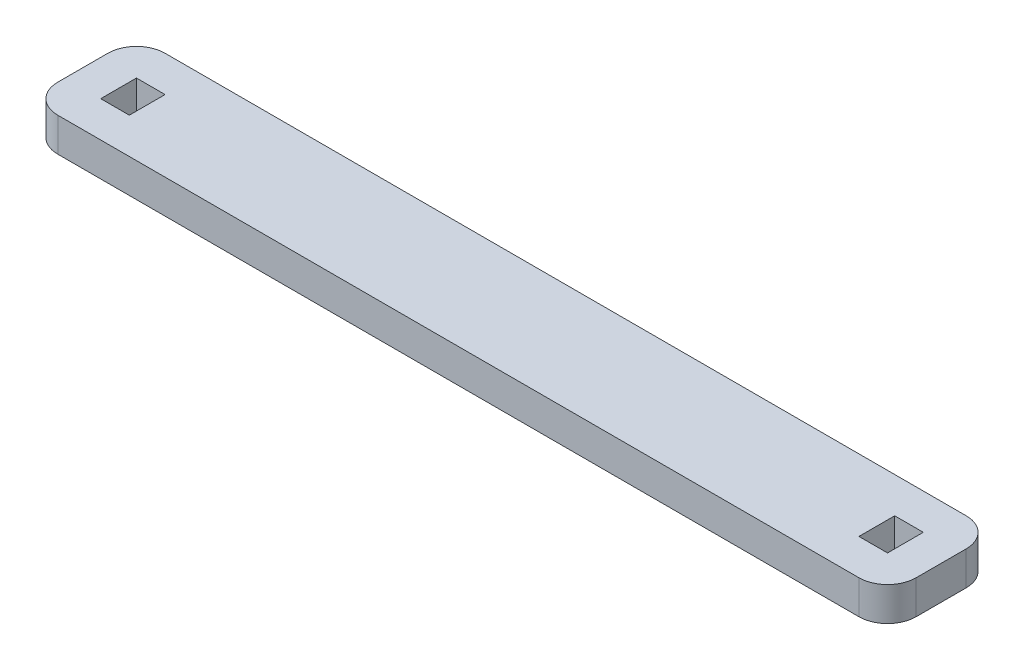
ISO-10303-21;
HEADER;
FILE_DESCRIPTION(('STEP AP214'),'2;1');
FILE_NAME('part.step','',(''),(''),'','','');
FILE_SCHEMA(('AUTOMOTIVE_DESIGN { 1 0 10303 214 1 1 1 1 }'));
ENDSEC;
DATA;
#1=APPLICATION_CONTEXT('core data for automotive mechanical design processes');
#2=APPLICATION_PROTOCOL_DEFINITION('international standard','automotive_design',2000,#1);
#3=PRODUCT_CONTEXT('',#1,'mechanical');
#4=PRODUCT('Part','Part','',(#3));
#5=PRODUCT_RELATED_PRODUCT_CATEGORY('part','',(#4));
#6=PRODUCT_DEFINITION_FORMATION('','',#4);
#7=PRODUCT_DEFINITION_CONTEXT('part definition',#1,'design');
#8=PRODUCT_DEFINITION('design','',#6,#7);
#9=PRODUCT_DEFINITION_SHAPE('','',#8);
#10=(LENGTH_UNIT() NAMED_UNIT(*) SI_UNIT(.MILLI.,.METRE.));
#11=(NAMED_UNIT(*) PLANE_ANGLE_UNIT() SI_UNIT($,.RADIAN.));
#12=(NAMED_UNIT(*) SI_UNIT($,.STERADIAN.) SOLID_ANGLE_UNIT());
#13=UNCERTAINTY_MEASURE_WITH_UNIT(LENGTH_MEASURE(1.E-05),#10,'distance_accuracy_value','');
#14=(GEOMETRIC_REPRESENTATION_CONTEXT(3) GLOBAL_UNCERTAINTY_ASSIGNED_CONTEXT((#13)) GLOBAL_UNIT_ASSIGNED_CONTEXT((#10,
#11,#12)) REPRESENTATION_CONTEXT('',''));
#15=CARTESIAN_POINT('',(0.,0.,0.));
#16=DIRECTION('',(0.,0.,1.));
#17=DIRECTION('',(1.,0.,0.));
#18=AXIS2_PLACEMENT_3D('',#15,#16,#17);
#19=CARTESIAN_POINT('',(0.,1.5,0.));
#20=DIRECTION('',(0.,1.,0.));
#21=DIRECTION('',(0.,0.,1.));
#22=AXIS2_PLACEMENT_3D('',#19,#20,#21);
#23=PLANE('',#22);
#24=DIRECTION('',(-1.,0.,0.));
#25=VECTOR('',#24,1.);
#26=CARTESIAN_POINT('',(38.1,1.5,-4.7625));
#27=LINE('',#26,#25);
#28=CARTESIAN_POINT('',(35.56,1.5,-4.7625));
#29=VERTEX_POINT('',#28);
#30=CARTESIAN_POINT('',(-35.56,1.5,-4.7625));
#31=VERTEX_POINT('',#30);
#32=EDGE_CURVE('E268',#29,#31,#27,.T.);
#33=ORIENTED_EDGE('',*,*,#32,.T.);
#34=CARTESIAN_POINT('',(-35.56,1.5,-2.2225));
#35=DIRECTION('',(0.,1.,0.));
#36=DIRECTION('',(0.,0.,1.));
#37=AXIS2_PLACEMENT_3D('',#34,#35,#36);
#38=CIRCLE('',#37,2.54);
#39=CARTESIAN_POINT('',(-38.1,1.5,-2.2225));
#40=VERTEX_POINT('',#39);
#41=EDGE_CURVE('E319',#31,#40,#38,.T.);
#42=ORIENTED_EDGE('',*,*,#41,.T.);
#43=DIRECTION('',(0.,0.,1.));
#44=VECTOR('',#43,1.);
#45=CARTESIAN_POINT('',(-38.1,1.5,4.7625));
#46=LINE('',#45,#44);
#47=CARTESIAN_POINT('',(-38.1,1.5,2.2225));
#48=VERTEX_POINT('',#47);
#49=EDGE_CURVE('E257',#40,#48,#46,.T.);
#50=ORIENTED_EDGE('',*,*,#49,.T.);
#51=CARTESIAN_POINT('',(-35.56,1.5,2.2225));
#52=DIRECTION('',(0.,1.,0.));
#53=DIRECTION('',(0.,0.,1.));
#54=AXIS2_PLACEMENT_3D('',#51,#52,#53);
#55=CIRCLE('',#54,2.54);
#56=CARTESIAN_POINT('',(-35.56,1.5,4.7625));
#57=VERTEX_POINT('',#56);
#58=EDGE_CURVE('E311',#48,#57,#55,.T.);
#59=ORIENTED_EDGE('',*,*,#58,.T.);
#60=DIRECTION('',(1.,0.,0.));
#61=VECTOR('',#60,1.);
#62=CARTESIAN_POINT('',(38.1,1.5,4.7625));
#63=LINE('',#62,#61);
#64=CARTESIAN_POINT('',(35.56,1.5,4.7625));
#65=VERTEX_POINT('',#64);
#66=EDGE_CURVE('E261',#57,#65,#63,.T.);
#67=ORIENTED_EDGE('',*,*,#66,.T.);
#68=CARTESIAN_POINT('',(35.56,1.5,2.2225));
#69=DIRECTION('',(0.,1.,0.));
#70=DIRECTION('',(0.,0.,1.));
#71=AXIS2_PLACEMENT_3D('',#68,#69,#70);
#72=CIRCLE('',#71,2.54);
#73=CARTESIAN_POINT('',(38.1,1.5,2.2225));
#74=VERTEX_POINT('',#73);
#75=EDGE_CURVE('E68',#65,#74,#72,.T.);
#76=ORIENTED_EDGE('',*,*,#75,.T.);
#77=DIRECTION('',(0.,0.,-1.));
#78=VECTOR('',#77,1.);
#79=CARTESIAN_POINT('',(38.1,1.5,4.7625));
#80=LINE('',#79,#78);
#81=CARTESIAN_POINT('',(38.1,1.5,-2.2225));
#82=VERTEX_POINT('',#81);
#83=EDGE_CURVE('E265',#74,#82,#80,.T.);
#84=ORIENTED_EDGE('',*,*,#83,.T.);
#85=CARTESIAN_POINT('',(35.56,1.5,-2.2225));
#86=DIRECTION('',(0.,1.,0.));
#87=DIRECTION('',(0.,0.,1.));
#88=AXIS2_PLACEMENT_3D('',#85,#86,#87);
#89=CIRCLE('',#88,2.54);
#90=EDGE_CURVE('E316',#82,#29,#89,.T.);
#91=ORIENTED_EDGE('',*,*,#90,.T.);
#92=EDGE_LOOP('',(#33,#42,#50,#59,#67,#76,#84,#91));
#93=FACE_BOUND('',#92,.T.);
#94=DIRECTION('',(1.,0.,0.));
#95=VECTOR('',#94,1.);
#96=CARTESIAN_POINT('',(-32.385,1.5,1.5875));
#97=LINE('',#96,#95);
#98=CARTESIAN_POINT('',(-34.925,1.5,1.5875));
#99=VERTEX_POINT('',#98);
#100=CARTESIAN_POINT('',(-32.385,1.5,1.5875));
#101=VERTEX_POINT('',#100);
#102=EDGE_CURVE('E217',#99,#101,#97,.T.);
#103=ORIENTED_EDGE('',*,*,#102,.F.);
#104=DIRECTION('',(0.,0.,1.));
#105=VECTOR('',#104,1.);
#106=CARTESIAN_POINT('',(-34.925,1.5,1.5875));
#107=LINE('',#106,#105);
#108=CARTESIAN_POINT('',(-34.925,1.5,-1.5875));
#109=VERTEX_POINT('',#108);
#110=EDGE_CURVE('E214',#109,#99,#107,.T.);
#111=ORIENTED_EDGE('',*,*,#110,.F.);
#112=DIRECTION('',(-1.,0.,0.));
#113=VECTOR('',#112,1.);
#114=CARTESIAN_POINT('',(-32.385,1.5,-1.5875));
#115=LINE('',#114,#113);
#116=CARTESIAN_POINT('',(-32.385,1.5,-1.5875));
#117=VERTEX_POINT('',#116);
#118=EDGE_CURVE('E225',#117,#109,#115,.T.);
#119=ORIENTED_EDGE('',*,*,#118,.F.);
#120=DIRECTION('',(0.,0.,-1.));
#121=VECTOR('',#120,1.);
#122=CARTESIAN_POINT('',(-32.385,1.5,1.5875));
#123=LINE('',#122,#121);
#124=EDGE_CURVE('E221',#101,#117,#123,.T.);
#125=ORIENTED_EDGE('',*,*,#124,.F.);
#126=EDGE_LOOP('',(#103,#111,#119,#125));
#127=FACE_BOUND('',#126,.T.);
#128=DIRECTION('',(1.,0.,0.));
#129=VECTOR('',#128,1.);
#130=CARTESIAN_POINT('',(34.925,1.5,1.5875));
#131=LINE('',#130,#129);
#132=CARTESIAN_POINT('',(32.385,1.5,1.5875));
#133=VERTEX_POINT('',#132);
#134=CARTESIAN_POINT('',(34.925,1.5,1.5875));
#135=VERTEX_POINT('',#134);
#136=EDGE_CURVE('E172',#133,#135,#131,.T.);
#137=ORIENTED_EDGE('',*,*,#136,.F.);
#138=DIRECTION('',(0.,0.,1.));
#139=VECTOR('',#138,1.);
#140=CARTESIAN_POINT('',(32.385,1.5,1.5875));
#141=LINE('',#140,#139);
#142=CARTESIAN_POINT('',(32.385,1.5,-1.5875));
#143=VERTEX_POINT('',#142);
#144=EDGE_CURVE('E161',#143,#133,#141,.T.);
#145=ORIENTED_EDGE('',*,*,#144,.F.);
#146=DIRECTION('',(-1.,0.,0.));
#147=VECTOR('',#146,1.);
#148=CARTESIAN_POINT('',(34.925,1.5,-1.5875));
#149=LINE('',#148,#147);
#150=CARTESIAN_POINT('',(34.925,1.5,-1.5875));
#151=VERTEX_POINT('',#150);
#152=EDGE_CURVE('E190',#151,#143,#149,.T.);
#153=ORIENTED_EDGE('',*,*,#152,.F.);
#154=DIRECTION('',(0.,0.,-1.));
#155=VECTOR('',#154,1.);
#156=CARTESIAN_POINT('',(34.925,1.5,1.5875));
#157=LINE('',#156,#155);
#158=EDGE_CURVE('E186',#135,#151,#157,.T.);
#159=ORIENTED_EDGE('',*,*,#158,.F.);
#160=EDGE_LOOP('',(#137,#145,#153,#159));
#161=FACE_BOUND('',#160,.T.);
#162=ADVANCED_FACE('F45',(#93,#127,#161),#23,.T.);
#163=CARTESIAN_POINT('',(0.,-1.5,0.));
#164=DIRECTION('',(0.,1.,0.));
#165=DIRECTION('',(0.,0.,1.));
#166=AXIS2_PLACEMENT_3D('',#163,#164,#165);
#167=PLANE('',#166);
#168=DIRECTION('',(0.,0.,1.));
#169=VECTOR('',#168,1.);
#170=CARTESIAN_POINT('',(-34.925,-1.5,1.5875));
#171=LINE('',#170,#169);
#172=CARTESIAN_POINT('',(-34.925,-1.5,-1.5875));
#173=VERTEX_POINT('',#172);
#174=CARTESIAN_POINT('',(-34.925,-1.5,1.5875));
#175=VERTEX_POINT('',#174);
#176=EDGE_CURVE('E181',#173,#175,#171,.T.);
#177=ORIENTED_EDGE('',*,*,#176,.T.);
#178=DIRECTION('',(1.,0.,0.));
#179=VECTOR('',#178,1.);
#180=CARTESIAN_POINT('',(-32.385,-1.5,1.5875));
#181=LINE('',#180,#179);
#182=CARTESIAN_POINT('',(-32.385,-1.5,1.5875));
#183=VERTEX_POINT('',#182);
#184=EDGE_CURVE('E232',#175,#183,#181,.T.);
#185=ORIENTED_EDGE('',*,*,#184,.T.);
#186=DIRECTION('',(0.,0.,-1.));
#187=VECTOR('',#186,1.);
#188=CARTESIAN_POINT('',(-32.385,-1.5,1.5875));
#189=LINE('',#188,#187);
#190=CARTESIAN_POINT('',(-32.385,-1.5,-1.5875));
#191=VERTEX_POINT('',#190);
#192=EDGE_CURVE('E236',#183,#191,#189,.T.);
#193=ORIENTED_EDGE('',*,*,#192,.T.);
#194=DIRECTION('',(-1.,0.,0.));
#195=VECTOR('',#194,1.);
#196=CARTESIAN_POINT('',(-32.385,-1.5,-1.5875));
#197=LINE('',#196,#195);
#198=EDGE_CURVE('E218',#191,#173,#197,.T.);
#199=ORIENTED_EDGE('',*,*,#198,.T.);
#200=EDGE_LOOP('',(#177,#185,#193,#199));
#201=FACE_BOUND('',#200,.T.);
#202=DIRECTION('',(0.,0.,1.));
#203=VECTOR('',#202,1.);
#204=CARTESIAN_POINT('',(-38.1,-1.5,4.7625));
#205=LINE('',#204,#203);
#206=CARTESIAN_POINT('',(-38.1,-1.5,-2.2225));
#207=VERTEX_POINT('',#206);
#208=CARTESIAN_POINT('',(-38.1,-1.5,2.2225));
#209=VERTEX_POINT('',#208);
#210=EDGE_CURVE('E256',#207,#209,#205,.T.);
#211=ORIENTED_EDGE('',*,*,#210,.F.);
#212=CARTESIAN_POINT('',(-35.56,-1.5,-2.2225));
#213=DIRECTION('',(0.,1.,0.));
#214=DIRECTION('',(0.,0.,1.));
#215=AXIS2_PLACEMENT_3D('',#212,#213,#214);
#216=CIRCLE('',#215,2.54);
#217=CARTESIAN_POINT('',(-35.56,-1.5,-4.7625));
#218=VERTEX_POINT('',#217);
#219=EDGE_CURVE('E301',#207,#218,#216,.F.);
#220=ORIENTED_EDGE('',*,*,#219,.T.);
#221=DIRECTION('',(-1.,0.,0.));
#222=VECTOR('',#221,1.);
#223=CARTESIAN_POINT('',(38.1,-1.5,-4.7625));
#224=LINE('',#223,#222);
#225=CARTESIAN_POINT('',(35.56,-1.5,-4.7625));
#226=VERTEX_POINT('',#225);
#227=EDGE_CURVE('E262',#226,#218,#224,.T.);
#228=ORIENTED_EDGE('',*,*,#227,.F.);
#229=CARTESIAN_POINT('',(35.56,-1.5,-2.2225));
#230=DIRECTION('',(0.,1.,0.));
#231=DIRECTION('',(0.,0.,1.));
#232=AXIS2_PLACEMENT_3D('',#229,#230,#231);
#233=CIRCLE('',#232,2.54);
#234=CARTESIAN_POINT('',(38.1,-1.5,-2.2225));
#235=VERTEX_POINT('',#234);
#236=EDGE_CURVE('E298',#226,#235,#233,.F.);
#237=ORIENTED_EDGE('',*,*,#236,.T.);
#238=DIRECTION('',(0.,0.,-1.));
#239=VECTOR('',#238,1.);
#240=CARTESIAN_POINT('',(38.1,-1.5,4.7625));
#241=LINE('',#240,#239);
#242=CARTESIAN_POINT('',(38.1,-1.5,2.2225));
#243=VERTEX_POINT('',#242);
#244=EDGE_CURVE('E280',#243,#235,#241,.T.);
#245=ORIENTED_EDGE('',*,*,#244,.F.);
#246=CARTESIAN_POINT('',(35.56,-1.5,2.2225));
#247=DIRECTION('',(0.,1.,0.));
#248=DIRECTION('',(0.,0.,1.));
#249=AXIS2_PLACEMENT_3D('',#246,#247,#248);
#250=CIRCLE('',#249,2.54);
#251=CARTESIAN_POINT('',(35.56,-1.5,4.7625));
#252=VERTEX_POINT('',#251);
#253=EDGE_CURVE('E295',#243,#252,#250,.F.);
#254=ORIENTED_EDGE('',*,*,#253,.T.);
#255=DIRECTION('',(1.,0.,0.));
#256=VECTOR('',#255,1.);
#257=CARTESIAN_POINT('',(38.1,-1.5,4.7625));
#258=LINE('',#257,#256);
#259=CARTESIAN_POINT('',(-35.56,-1.5,4.7625));
#260=VERTEX_POINT('',#259);
#261=EDGE_CURVE('E276',#260,#252,#258,.T.);
#262=ORIENTED_EDGE('',*,*,#261,.F.);
#263=CARTESIAN_POINT('',(-35.56,-1.5,2.2225));
#264=DIRECTION('',(0.,1.,0.));
#265=DIRECTION('',(0.,0.,1.));
#266=AXIS2_PLACEMENT_3D('',#263,#264,#265);
#267=CIRCLE('',#266,2.54);
#268=EDGE_CURVE('E292',#260,#209,#267,.F.);
#269=ORIENTED_EDGE('',*,*,#268,.T.);
#270=EDGE_LOOP('',(#211,#220,#228,#237,#245,#254,#262,#269));
#271=FACE_BOUND('',#270,.T.);
#272=DIRECTION('',(0.,0.,1.));
#273=VECTOR('',#272,1.);
#274=CARTESIAN_POINT('',(32.385,-1.5,1.5875));
#275=LINE('',#274,#273);
#276=CARTESIAN_POINT('',(32.385,-1.5,-1.5875));
#277=VERTEX_POINT('',#276);
#278=CARTESIAN_POINT('',(32.385,-1.5,1.5875));
#279=VERTEX_POINT('',#278);
#280=EDGE_CURVE('E195',#277,#279,#275,.T.);
#281=ORIENTED_EDGE('',*,*,#280,.T.);
#282=DIRECTION('',(1.,0.,0.));
#283=VECTOR('',#282,1.);
#284=CARTESIAN_POINT('',(34.925,-1.5,1.5875));
#285=LINE('',#284,#283);
#286=CARTESIAN_POINT('',(34.925,-1.5,1.5875));
#287=VERTEX_POINT('',#286);
#288=EDGE_CURVE('E179',#279,#287,#285,.T.);
#289=ORIENTED_EDGE('',*,*,#288,.T.);
#290=DIRECTION('',(0.,0.,-1.));
#291=VECTOR('',#290,1.);
#292=CARTESIAN_POINT('',(34.925,-1.5,1.5875));
#293=LINE('',#292,#291);
#294=CARTESIAN_POINT('',(34.925,-1.5,-1.5875));
#295=VERTEX_POINT('',#294);
#296=EDGE_CURVE('E200',#287,#295,#293,.T.);
#297=ORIENTED_EDGE('',*,*,#296,.T.);
#298=DIRECTION('',(-1.,0.,0.));
#299=VECTOR('',#298,1.);
#300=CARTESIAN_POINT('',(34.925,-1.5,-1.5875));
#301=LINE('',#300,#299);
#302=EDGE_CURVE('E173',#295,#277,#301,.T.);
#303=ORIENTED_EDGE('',*,*,#302,.T.);
#304=EDGE_LOOP('',(#281,#289,#297,#303));
#305=FACE_BOUND('',#304,.T.);
#306=ADVANCED_FACE('F339',(#201,#271,#305),#167,.F.);
#307=CARTESIAN_POINT('',(-38.1,1.5,4.7625));
#308=DIRECTION('',(1.,0.,0.));
#309=DIRECTION('',(0.,0.,-1.));
#310=AXIS2_PLACEMENT_3D('',#307,#308,#309);
#311=PLANE('',#310);
#312=ORIENTED_EDGE('',*,*,#49,.F.);
#313=DIRECTION('',(0.,-1.,0.));
#314=VECTOR('',#313,1.);
#315=CARTESIAN_POINT('',(-38.1,1.5,-2.2225));
#316=LINE('',#315,#314);
#317=EDGE_CURVE('E288',#40,#207,#316,.T.);
#318=ORIENTED_EDGE('',*,*,#317,.T.);
#319=ORIENTED_EDGE('',*,*,#210,.T.);
#320=DIRECTION('',(0.,-1.,0.));
#321=VECTOR('',#320,1.);
#322=CARTESIAN_POINT('',(-38.1,1.5,2.2225));
#323=LINE('',#322,#321);
#324=EDGE_CURVE('E272',#209,#48,#323,.F.);
#325=ORIENTED_EDGE('',*,*,#324,.T.);
#326=EDGE_LOOP('',(#312,#318,#319,#325));
#327=FACE_BOUND('',#326,.T.);
#328=ADVANCED_FACE('F362',(#327),#311,.F.);
#329=CARTESIAN_POINT('',(38.1,1.5,4.7625));
#330=DIRECTION('',(0.,0.,-1.));
#331=DIRECTION('',(-1.,0.,0.));
#332=AXIS2_PLACEMENT_3D('',#329,#330,#331);
#333=PLANE('',#332);
#334=ORIENTED_EDGE('',*,*,#261,.T.);
#335=DIRECTION('',(0.,-1.,0.));
#336=VECTOR('',#335,1.);
#337=CARTESIAN_POINT('',(35.56,1.5,4.7625));
#338=LINE('',#337,#336);
#339=EDGE_CURVE('E11',#252,#65,#338,.F.);
#340=ORIENTED_EDGE('',*,*,#339,.T.);
#341=ORIENTED_EDGE('',*,*,#66,.F.);
#342=DIRECTION('',(0.,-1.,0.));
#343=VECTOR('',#342,1.);
#344=CARTESIAN_POINT('',(-35.56,1.5,4.7625));
#345=LINE('',#344,#343);
#346=EDGE_CURVE('E54',#57,#260,#345,.T.);
#347=ORIENTED_EDGE('',*,*,#346,.T.);
#348=EDGE_LOOP('',(#334,#340,#341,#347));
#349=FACE_BOUND('',#348,.T.);
#350=ADVANCED_FACE('F333',(#349),#333,.F.);
#351=CARTESIAN_POINT('',(38.1,1.5,4.7625));
#352=DIRECTION('',(-1.,0.,0.));
#353=DIRECTION('',(0.,0.,1.));
#354=AXIS2_PLACEMENT_3D('',#351,#352,#353);
#355=PLANE('',#354);
#356=ORIENTED_EDGE('',*,*,#244,.T.);
#357=DIRECTION('',(0.,-1.,0.));
#358=VECTOR('',#357,1.);
#359=CARTESIAN_POINT('',(38.1,1.5,-2.2225));
#360=LINE('',#359,#358);
#361=EDGE_CURVE('E61',#235,#82,#360,.F.);
#362=ORIENTED_EDGE('',*,*,#361,.T.);
#363=ORIENTED_EDGE('',*,*,#83,.F.);
#364=DIRECTION('',(0.,-1.,0.));
#365=VECTOR('',#364,1.);
#366=CARTESIAN_POINT('',(38.1,1.5,2.2225));
#367=LINE('',#366,#365);
#368=EDGE_CURVE('E322',#74,#243,#367,.T.);
#369=ORIENTED_EDGE('',*,*,#368,.T.);
#370=EDGE_LOOP('',(#356,#362,#363,#369));
#371=FACE_BOUND('',#370,.T.);
#372=ADVANCED_FACE('F345',(#371),#355,.F.);
#373=CARTESIAN_POINT('',(38.1,1.5,-4.7625));
#374=DIRECTION('',(0.,0.,1.));
#375=DIRECTION('',(1.,0.,0.));
#376=AXIS2_PLACEMENT_3D('',#373,#374,#375);
#377=PLANE('',#376);
#378=ORIENTED_EDGE('',*,*,#227,.T.);
#379=DIRECTION('',(0.,-1.,0.));
#380=VECTOR('',#379,1.);
#381=CARTESIAN_POINT('',(-35.56,1.5,-4.7625));
#382=LINE('',#381,#380);
#383=EDGE_CURVE('E308',#218,#31,#382,.F.);
#384=ORIENTED_EDGE('',*,*,#383,.T.);
#385=ORIENTED_EDGE('',*,*,#32,.F.);
#386=DIRECTION('',(0.,-1.,0.));
#387=VECTOR('',#386,1.);
#388=CARTESIAN_POINT('',(35.56,1.5,-4.7625));
#389=LINE('',#388,#387);
#390=EDGE_CURVE('E304',#29,#226,#389,.T.);
#391=ORIENTED_EDGE('',*,*,#390,.T.);
#392=EDGE_LOOP('',(#378,#384,#385,#391));
#393=FACE_BOUND('',#392,.T.);
#394=ADVANCED_FACE('F354',(#393),#377,.F.);
#395=CARTESIAN_POINT('',(-34.925,1.5,1.5875));
#396=DIRECTION('',(1.,0.,0.));
#397=DIRECTION('',(0.,0.,-1.));
#398=AXIS2_PLACEMENT_3D('',#395,#396,#397);
#399=PLANE('',#398);
#400=ORIENTED_EDGE('',*,*,#176,.F.);
#401=DIRECTION('',(0.,-1.,0.));
#402=VECTOR('',#401,1.);
#403=CARTESIAN_POINT('',(-34.925,1.5,-1.5875));
#404=LINE('',#403,#402);
#405=EDGE_CURVE('E228',#109,#173,#404,.T.);
#406=ORIENTED_EDGE('',*,*,#405,.F.);
#407=ORIENTED_EDGE('',*,*,#110,.T.);
#408=DIRECTION('',(0.,-1.,0.));
#409=VECTOR('',#408,1.);
#410=CARTESIAN_POINT('',(-34.925,1.5,1.5875));
#411=LINE('',#410,#409);
#412=EDGE_CURVE('E252',#99,#175,#411,.T.);
#413=ORIENTED_EDGE('',*,*,#412,.T.);
#414=EDGE_LOOP('',(#400,#406,#407,#413));
#415=FACE_BOUND('',#414,.T.);
#416=ADVANCED_FACE('F377',(#415),#399,.T.);
#417=CARTESIAN_POINT('',(-32.385,1.5,1.5875));
#418=DIRECTION('',(0.,0.,-1.));
#419=DIRECTION('',(-1.,0.,0.));
#420=AXIS2_PLACEMENT_3D('',#417,#418,#419);
#421=PLANE('',#420);
#422=ORIENTED_EDGE('',*,*,#184,.F.);
#423=ORIENTED_EDGE('',*,*,#412,.F.);
#424=ORIENTED_EDGE('',*,*,#102,.T.);
#425=DIRECTION('',(0.,-1.,0.));
#426=VECTOR('',#425,1.);
#427=CARTESIAN_POINT('',(-32.385,1.5,1.5875));
#428=LINE('',#427,#426);
#429=EDGE_CURVE('E249',#101,#183,#428,.T.);
#430=ORIENTED_EDGE('',*,*,#429,.T.);
#431=EDGE_LOOP('',(#422,#423,#424,#430));
#432=FACE_BOUND('',#431,.T.);
#433=ADVANCED_FACE('F459',(#432),#421,.T.);
#434=CARTESIAN_POINT('',(-32.385,1.5,1.5875));
#435=DIRECTION('',(-1.,0.,0.));
#436=DIRECTION('',(0.,0.,1.));
#437=AXIS2_PLACEMENT_3D('',#434,#435,#436);
#438=PLANE('',#437);
#439=ORIENTED_EDGE('',*,*,#192,.F.);
#440=ORIENTED_EDGE('',*,*,#429,.F.);
#441=ORIENTED_EDGE('',*,*,#124,.T.);
#442=DIRECTION('',(0.,-1.,0.));
#443=VECTOR('',#442,1.);
#444=CARTESIAN_POINT('',(-32.385,1.5,-1.5875));
#445=LINE('',#444,#443);
#446=EDGE_CURVE('E246',#117,#191,#445,.T.);
#447=ORIENTED_EDGE('',*,*,#446,.T.);
#448=EDGE_LOOP('',(#439,#440,#441,#447));
#449=FACE_BOUND('',#448,.T.);
#450=ADVANCED_FACE('F450',(#449),#438,.T.);
#451=CARTESIAN_POINT('',(-32.385,1.5,-1.5875));
#452=DIRECTION('',(0.,0.,1.));
#453=DIRECTION('',(1.,0.,0.));
#454=AXIS2_PLACEMENT_3D('',#451,#452,#453);
#455=PLANE('',#454);
#456=ORIENTED_EDGE('',*,*,#198,.F.);
#457=ORIENTED_EDGE('',*,*,#446,.F.);
#458=ORIENTED_EDGE('',*,*,#118,.T.);
#459=ORIENTED_EDGE('',*,*,#405,.T.);
#460=EDGE_LOOP('',(#456,#457,#458,#459));
#461=FACE_BOUND('',#460,.T.);
#462=ADVANCED_FACE('F442',(#461),#455,.T.);
#463=CARTESIAN_POINT('',(32.385,1.5,1.5875));
#464=DIRECTION('',(1.,0.,0.));
#465=DIRECTION('',(0.,0.,-1.));
#466=AXIS2_PLACEMENT_3D('',#463,#464,#465);
#467=PLANE('',#466);
#468=ORIENTED_EDGE('',*,*,#280,.F.);
#469=DIRECTION('',(0.,-1.,0.));
#470=VECTOR('',#469,1.);
#471=CARTESIAN_POINT('',(32.385,1.5,-1.5875));
#472=LINE('',#471,#470);
#473=EDGE_CURVE('E167',#143,#277,#472,.T.);
#474=ORIENTED_EDGE('',*,*,#473,.F.);
#475=ORIENTED_EDGE('',*,*,#144,.T.);
#476=DIRECTION('',(0.,-1.,0.));
#477=VECTOR('',#476,1.);
#478=CARTESIAN_POINT('',(32.385,1.5,1.5875));
#479=LINE('',#478,#477);
#480=EDGE_CURVE('E164',#133,#279,#479,.T.);
#481=ORIENTED_EDGE('',*,*,#480,.T.);
#482=EDGE_LOOP('',(#468,#474,#475,#481));
#483=FACE_BOUND('',#482,.T.);
#484=ADVANCED_FACE('F163',(#483),#467,.T.);
#485=CARTESIAN_POINT('',(34.925,1.5,1.5875));
#486=DIRECTION('',(0.,0.,-1.));
#487=DIRECTION('',(-1.,0.,0.));
#488=AXIS2_PLACEMENT_3D('',#485,#486,#487);
#489=PLANE('',#488);
#490=ORIENTED_EDGE('',*,*,#288,.F.);
#491=ORIENTED_EDGE('',*,*,#480,.F.);
#492=ORIENTED_EDGE('',*,*,#136,.T.);
#493=DIRECTION('',(0.,-1.,0.));
#494=VECTOR('',#493,1.);
#495=CARTESIAN_POINT('',(34.925,1.5,1.5875));
#496=LINE('',#495,#494);
#497=EDGE_CURVE('E182',#135,#287,#496,.T.);
#498=ORIENTED_EDGE('',*,*,#497,.T.);
#499=EDGE_LOOP('',(#490,#491,#492,#498));
#500=FACE_BOUND('',#499,.T.);
#501=ADVANCED_FACE('F176',(#500),#489,.T.);
#502=CARTESIAN_POINT('',(34.925,1.5,1.5875));
#503=DIRECTION('',(-1.,0.,0.));
#504=DIRECTION('',(0.,0.,1.));
#505=AXIS2_PLACEMENT_3D('',#502,#503,#504);
#506=PLANE('',#505);
#507=ORIENTED_EDGE('',*,*,#296,.F.);
#508=ORIENTED_EDGE('',*,*,#497,.F.);
#509=ORIENTED_EDGE('',*,*,#158,.T.);
#510=DIRECTION('',(0.,-1.,0.));
#511=VECTOR('',#510,1.);
#512=CARTESIAN_POINT('',(34.925,1.5,-1.5875));
#513=LINE('',#512,#511);
#514=EDGE_CURVE('E209',#151,#295,#513,.T.);
#515=ORIENTED_EDGE('',*,*,#514,.T.);
#516=EDGE_LOOP('',(#507,#508,#509,#515));
#517=FACE_BOUND('',#516,.T.);
#518=ADVANCED_FACE('F418',(#517),#506,.T.);
#519=CARTESIAN_POINT('',(34.925,1.5,-1.5875));
#520=DIRECTION('',(0.,0.,1.));
#521=DIRECTION('',(1.,0.,0.));
#522=AXIS2_PLACEMENT_3D('',#519,#520,#521);
#523=PLANE('',#522);
#524=ORIENTED_EDGE('',*,*,#302,.F.);
#525=ORIENTED_EDGE('',*,*,#514,.F.);
#526=ORIENTED_EDGE('',*,*,#152,.T.);
#527=ORIENTED_EDGE('',*,*,#473,.T.);
#528=EDGE_LOOP('',(#524,#525,#526,#527));
#529=FACE_BOUND('',#528,.T.);
#530=ADVANCED_FACE('F390',(#529),#523,.T.);
#531=CARTESIAN_POINT('',(-35.56,1.5,-2.2225));
#532=DIRECTION('',(0.,-1.,0.));
#533=DIRECTION('',(0.,0.,-1.));
#534=AXIS2_PLACEMENT_3D('',#531,#532,#533);
#535=CYLINDRICAL_SURFACE('',#534,2.54);
#536=ORIENTED_EDGE('',*,*,#41,.F.);
#537=ORIENTED_EDGE('',*,*,#383,.F.);
#538=ORIENTED_EDGE('',*,*,#219,.F.);
#539=ORIENTED_EDGE('',*,*,#317,.F.);
#540=EDGE_LOOP('',(#536,#537,#538,#539));
#541=FACE_BOUND('',#540,.T.);
#542=ADVANCED_FACE('F359',(#541),#535,.T.);
#543=CARTESIAN_POINT('',(35.56,1.5,-2.2225));
#544=DIRECTION('',(0.,-1.,0.));
#545=DIRECTION('',(0.,0.,-1.));
#546=AXIS2_PLACEMENT_3D('',#543,#544,#545);
#547=CYLINDRICAL_SURFACE('',#546,2.54);
#548=ORIENTED_EDGE('',*,*,#90,.F.);
#549=ORIENTED_EDGE('',*,*,#361,.F.);
#550=ORIENTED_EDGE('',*,*,#236,.F.);
#551=ORIENTED_EDGE('',*,*,#390,.F.);
#552=EDGE_LOOP('',(#548,#549,#550,#551));
#553=FACE_BOUND('',#552,.T.);
#554=ADVANCED_FACE('F351',(#553),#547,.T.);
#555=CARTESIAN_POINT('',(35.56,1.5,2.2225));
#556=DIRECTION('',(0.,-1.,0.));
#557=DIRECTION('',(0.,0.,-1.));
#558=AXIS2_PLACEMENT_3D('',#555,#556,#557);
#559=CYLINDRICAL_SURFACE('',#558,2.54);
#560=ORIENTED_EDGE('',*,*,#75,.F.);
#561=ORIENTED_EDGE('',*,*,#339,.F.);
#562=ORIENTED_EDGE('',*,*,#253,.F.);
#563=ORIENTED_EDGE('',*,*,#368,.F.);
#564=EDGE_LOOP('',(#560,#561,#562,#563));
#565=FACE_BOUND('',#564,.T.);
#566=ADVANCED_FACE('F344',(#565),#559,.T.);
#567=CARTESIAN_POINT('',(-35.56,1.5,2.2225));
#568=DIRECTION('',(0.,-1.,0.));
#569=DIRECTION('',(0.,0.,-1.));
#570=AXIS2_PLACEMENT_3D('',#567,#568,#569);
#571=CYLINDRICAL_SURFACE('',#570,2.54);
#572=ORIENTED_EDGE('',*,*,#58,.F.);
#573=ORIENTED_EDGE('',*,*,#324,.F.);
#574=ORIENTED_EDGE('',*,*,#268,.F.);
#575=ORIENTED_EDGE('',*,*,#346,.F.);
#576=EDGE_LOOP('',(#572,#573,#574,#575));
#577=FACE_BOUND('',#576,.T.);
#578=ADVANCED_FACE('F47',(#577),#571,.T.);
#579=CLOSED_SHELL('',(#162,#306,#328,#350,#372,#394,#416,#433,#450,#462,#484,#501,#518,#530,
#542,#554,#566,#578));
#580=MANIFOLD_SOLID_BREP('B2',#579);
#581=ADVANCED_BREP_SHAPE_REPRESENTATION('',(#18,#580),#14);
#582=SHAPE_DEFINITION_REPRESENTATION(#9,#581);
ENDSEC;
END-ISO-10303-21;
